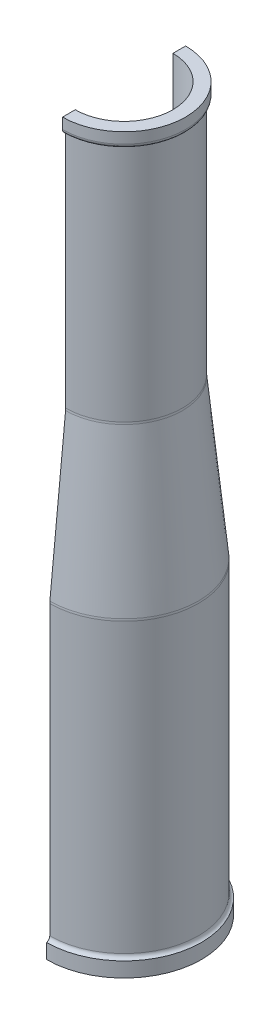
ISO-10303-21;
HEADER;
FILE_DESCRIPTION(('STEP AP214'),'2;1');
FILE_NAME('part.step','',(''),(''),'','','');
FILE_SCHEMA(('AUTOMOTIVE_DESIGN { 1 0 10303 214 1 1 1 1 }'));
ENDSEC;
DATA;
#1=APPLICATION_CONTEXT('core data for automotive mechanical design processes');
#2=APPLICATION_PROTOCOL_DEFINITION('international standard','automotive_design',2000,#1);
#3=PRODUCT_CONTEXT('',#1,'mechanical');
#4=PRODUCT('Part','Part','',(#3));
#5=PRODUCT_RELATED_PRODUCT_CATEGORY('part','',(#4));
#6=PRODUCT_DEFINITION_FORMATION('','',#4);
#7=PRODUCT_DEFINITION_CONTEXT('part definition',#1,'design');
#8=PRODUCT_DEFINITION('design','',#6,#7);
#9=PRODUCT_DEFINITION_SHAPE('','',#8);
#10=(LENGTH_UNIT() NAMED_UNIT(*) SI_UNIT(.MILLI.,.METRE.));
#11=(NAMED_UNIT(*) PLANE_ANGLE_UNIT() SI_UNIT($,.RADIAN.));
#12=(NAMED_UNIT(*) SI_UNIT($,.STERADIAN.) SOLID_ANGLE_UNIT());
#13=UNCERTAINTY_MEASURE_WITH_UNIT(LENGTH_MEASURE(1.E-05),#10,'distance_accuracy_value','');
#14=(GEOMETRIC_REPRESENTATION_CONTEXT(3) GLOBAL_UNCERTAINTY_ASSIGNED_CONTEXT((#13)) GLOBAL_UNIT_ASSIGNED_CONTEXT((#10,
#11,#12)) REPRESENTATION_CONTEXT('',''));
#15=CARTESIAN_POINT('',(0.,0.,0.));
#16=DIRECTION('',(0.,0.,1.));
#17=DIRECTION('',(1.,0.,0.));
#18=AXIS2_PLACEMENT_3D('',#15,#16,#17);
#19=CARTESIAN_POINT('',(0.,340.,0.));
#20=DIRECTION('',(0.,-1.,0.));
#21=DIRECTION('',(0.,0.,-1.));
#22=AXIS2_PLACEMENT_3D('',#19,#20,#21);
#23=CYLINDRICAL_SURFACE('',#22,27.5);
#24=CARTESIAN_POINT('',(0.,333.,0.));
#25=DIRECTION('',(0.,1.,0.));
#26=DIRECTION('',(0.,0.,1.));
#27=AXIS2_PLACEMENT_3D('',#24,#25,#26);
#28=CIRCLE('',#27,27.5);
#29=CARTESIAN_POINT('',(0.,333.,27.5));
#30=VERTEX_POINT('',#29);
#31=CARTESIAN_POINT('',(0.,333.,-27.5));
#32=VERTEX_POINT('',#31);
#33=EDGE_CURVE('E167',#30,#32,#28,.T.);
#34=ORIENTED_EDGE('',*,*,#33,.F.);
#35=DIRECTION('',(0.,-1.,0.));
#36=VECTOR('',#35,1.);
#37=CARTESIAN_POINT('',(0.,340.,27.5));
#38=LINE('',#37,#36);
#39=CARTESIAN_POINT('',(0.,220.498756211209,27.5));
#40=VERTEX_POINT('',#39);
#41=EDGE_CURVE('E190',#30,#40,#38,.T.);
#42=ORIENTED_EDGE('',*,*,#41,.T.);
#43=CARTESIAN_POINT('',(0.,220.498756211209,0.));
#44=DIRECTION('',(0.,1.,0.));
#45=DIRECTION('',(0.,0.,1.));
#46=AXIS2_PLACEMENT_3D('',#43,#44,#45);
#47=CIRCLE('',#46,27.5);
#48=CARTESIAN_POINT('',(0.,220.498756211209,-27.5));
#49=VERTEX_POINT('',#48);
#50=EDGE_CURVE('E150',#40,#49,#47,.T.);
#51=ORIENTED_EDGE('',*,*,#50,.T.);
#52=DIRECTION('',(0.,-1.,0.));
#53=VECTOR('',#52,1.);
#54=CARTESIAN_POINT('',(0.,340.,-27.5));
#55=LINE('',#54,#53);
#56=EDGE_CURVE('E216',#49,#32,#55,.F.);
#57=ORIENTED_EDGE('',*,*,#56,.T.);
#58=EDGE_LOOP('',(#34,#42,#51,#57));
#59=FACE_BOUND('',#58,.T.);
#60=ADVANCED_FACE('F38',(#59),#23,.T.);
#61=CARTESIAN_POINT('',(0.,145.,0.));
#62=DIRECTION('',(0.,-1.,0.));
#63=DIRECTION('',(0.,0.,-1.));
#64=AXIS2_PLACEMENT_3D('',#61,#62,#63);
#65=CYLINDRICAL_SURFACE('',#64,35.);
#66=CARTESIAN_POINT('',(0.,144.501243788791,0.));
#67=DIRECTION('',(0.,-1.,0.));
#68=DIRECTION('',(0.,0.,-1.));
#69=AXIS2_PLACEMENT_3D('',#66,#67,#68);
#70=CIRCLE('',#69,35.);
#71=CARTESIAN_POINT('',(0.,144.501243788791,-35.));
#72=VERTEX_POINT('',#71);
#73=CARTESIAN_POINT('',(0.,144.501243788791,35.));
#74=VERTEX_POINT('',#73);
#75=EDGE_CURVE('E164',#72,#74,#70,.T.);
#76=ORIENTED_EDGE('',*,*,#75,.T.);
#77=DIRECTION('',(0.,-1.,0.));
#78=VECTOR('',#77,1.);
#79=CARTESIAN_POINT('',(0.,145.,35.));
#80=LINE('',#79,#78);
#81=CARTESIAN_POINT('',(0.,8.93649167310371,35.));
#82=VERTEX_POINT('',#81);
#83=EDGE_CURVE('E143',#74,#82,#80,.T.);
#84=ORIENTED_EDGE('',*,*,#83,.T.);
#85=CARTESIAN_POINT('',(0.,8.9364916731037,0.));
#86=DIRECTION('',(0.,-1.,0.));
#87=DIRECTION('',(0.,0.,-1.));
#88=AXIS2_PLACEMENT_3D('',#85,#86,#87);
#89=CIRCLE('',#88,35.);
#90=CARTESIAN_POINT('',(0.,8.9364916731037,-35.));
#91=VERTEX_POINT('',#90);
#92=EDGE_CURVE('E171',#82,#91,#89,.F.);
#93=ORIENTED_EDGE('',*,*,#92,.T.);
#94=DIRECTION('',(0.,-1.,0.));
#95=VECTOR('',#94,1.);
#96=CARTESIAN_POINT('',(0.,145.,-35.));
#97=LINE('',#96,#95);
#98=EDGE_CURVE('E60',#91,#72,#97,.F.);
#99=ORIENTED_EDGE('',*,*,#98,.T.);
#100=EDGE_LOOP('',(#76,#84,#93,#99));
#101=FACE_BOUND('',#100,.T.);
#102=ADVANCED_FACE('F177',(#101),#65,.T.);
#103=CARTESIAN_POINT('',(0.,220.,0.));
#104=DIRECTION('',(0.,-1.,0.));
#105=DIRECTION('',(0.,0.,-1.));
#106=AXIS2_PLACEMENT_3D('',#103,#104,#105);
#107=CONICAL_SURFACE('',#106,27.5,0.0996686524911622);
#108=DIRECTION('',(0.,-0.995037190209989,0.0995037190209991));
#109=VECTOR('',#108,1.);
#110=CARTESIAN_POINT('',(0.,495.,0.));
#111=LINE('',#110,#109);
#112=CARTESIAN_POINT('',(0.,145.496280979001,34.9503719020999));
#113=VERTEX_POINT('',#112);
#114=CARTESIAN_POINT('',(0.,219.503719020999,27.5496280979001));
#115=VERTEX_POINT('',#114);
#116=EDGE_CURVE('E182',#113,#115,#111,.F.);
#117=ORIENTED_EDGE('',*,*,#116,.F.);
#118=CARTESIAN_POINT('',(0.,145.496280979001,0.));
#119=DIRECTION('',(0.,-1.,0.));
#120=DIRECTION('',(0.,0.,-1.));
#121=AXIS2_PLACEMENT_3D('',#118,#119,#120);
#122=CIRCLE('',#121,34.9503719020999);
#123=CARTESIAN_POINT('',(0.,145.496280979001,-34.9503719020999));
#124=VERTEX_POINT('',#123);
#125=EDGE_CURVE('E158',#113,#124,#122,.F.);
#126=ORIENTED_EDGE('',*,*,#125,.T.);
#127=DIRECTION('',(0.,0.995037190209989,0.0995037190209991));
#128=VECTOR('',#127,1.);
#129=CARTESIAN_POINT('',(0.,495.,0.));
#130=LINE('',#129,#128);
#131=CARTESIAN_POINT('',(0.,219.503719020999,-27.5496280979001));
#132=VERTEX_POINT('',#131);
#133=EDGE_CURVE('E222',#132,#124,#130,.F.);
#134=ORIENTED_EDGE('',*,*,#133,.F.);
#135=CARTESIAN_POINT('',(0.,219.503719020999,0.));
#136=DIRECTION('',(0.,1.,0.));
#137=DIRECTION('',(0.,0.,1.));
#138=AXIS2_PLACEMENT_3D('',#135,#136,#137);
#139=CIRCLE('',#138,27.5496280979001);
#140=EDGE_CURVE('E161',#132,#115,#139,.F.);
#141=ORIENTED_EDGE('',*,*,#140,.T.);
#142=EDGE_LOOP('',(#117,#126,#134,#141));
#143=FACE_BOUND('',#142,.T.);
#144=ADVANCED_FACE('F244',(#143),#107,.T.);
#145=CARTESIAN_POINT('',(0.,340.,0.));
#146=DIRECTION('',(0.,1.,0.));
#147=DIRECTION('',(0.,0.,1.));
#148=AXIS2_PLACEMENT_3D('',#145,#146,#147);
#149=PLANE('',#148);
#150=DIRECTION('',(0.,0.,-1.));
#151=VECTOR('',#150,1.);
#152=CARTESIAN_POINT('',(0.,340.,0.));
#153=LINE('',#152,#151);
#154=CARTESIAN_POINT('',(0.,340.,29.));
#155=VERTEX_POINT('',#154);
#156=CARTESIAN_POINT('',(0.,340.,23.));
#157=VERTEX_POINT('',#156);
#158=EDGE_CURVE('E197',#155,#157,#153,.T.);
#159=ORIENTED_EDGE('',*,*,#158,.F.);
#160=CARTESIAN_POINT('',(0.,340.,0.));
#161=DIRECTION('',(0.,1.,0.));
#162=DIRECTION('',(0.,0.,1.));
#163=AXIS2_PLACEMENT_3D('',#160,#161,#162);
#164=CIRCLE('',#163,29.);
#165=CARTESIAN_POINT('',(0.,340.,-29.));
#166=VERTEX_POINT('',#165);
#167=EDGE_CURVE('E199',#155,#166,#164,.T.);
#168=ORIENTED_EDGE('',*,*,#167,.T.);
#169=CARTESIAN_POINT('',(0.,340.,-23.));
#170=VERTEX_POINT('',#169);
#171=EDGE_CURVE('E209',#170,#166,#153,.T.);
#172=ORIENTED_EDGE('',*,*,#171,.F.);
#173=CARTESIAN_POINT('',(0.,340.,0.));
#174=DIRECTION('',(0.,1.,0.));
#175=DIRECTION('',(0.,0.,1.));
#176=AXIS2_PLACEMENT_3D('',#173,#174,#175);
#177=CIRCLE('',#176,23.);
#178=EDGE_CURVE('E148',#157,#170,#177,.T.);
#179=ORIENTED_EDGE('',*,*,#178,.F.);
#180=EDGE_LOOP('',(#159,#168,#172,#179));
#181=FACE_BOUND('',#180,.T.);
#182=ADVANCED_FACE('F249',(#181),#149,.T.);
#183=CARTESIAN_POINT('',(0.,7.,0.));
#184=DIRECTION('',(0.,-1.,0.));
#185=DIRECTION('',(0.,0.,-1.));
#186=AXIS2_PLACEMENT_3D('',#183,#184,#185);
#187=CYLINDRICAL_SURFACE('',#186,36.5);
#188=DIRECTION('',(0.,-1.,0.));
#189=VECTOR('',#188,1.);
#190=CARTESIAN_POINT('',(0.,7.,36.5));
#191=LINE('',#190,#189);
#192=CARTESIAN_POINT('',(0.,0.,36.5));
#193=VERTEX_POINT('',#192);
#194=CARTESIAN_POINT('',(0.,7.,36.5));
#195=VERTEX_POINT('',#194);
#196=EDGE_CURVE('E53',#193,#195,#191,.F.);
#197=ORIENTED_EDGE('',*,*,#196,.F.);
#198=CARTESIAN_POINT('',(0.,0.,0.));
#199=DIRECTION('',(0.,-1.,0.));
#200=DIRECTION('',(0.,0.,-1.));
#201=AXIS2_PLACEMENT_3D('',#198,#199,#200);
#202=CIRCLE('',#201,36.5);
#203=CARTESIAN_POINT('',(0.,0.,-36.5));
#204=VERTEX_POINT('',#203);
#205=EDGE_CURVE('E140',#204,#193,#202,.T.);
#206=ORIENTED_EDGE('',*,*,#205,.F.);
#207=DIRECTION('',(0.,-1.,0.));
#208=VECTOR('',#207,1.);
#209=CARTESIAN_POINT('',(0.,7.,-36.5));
#210=LINE('',#209,#208);
#211=CARTESIAN_POINT('',(0.,7.,-36.5));
#212=VERTEX_POINT('',#211);
#213=EDGE_CURVE('E132',#212,#204,#210,.T.);
#214=ORIENTED_EDGE('',*,*,#213,.F.);
#215=CARTESIAN_POINT('',(0.,7.,0.));
#216=DIRECTION('',(0.,-1.,0.));
#217=DIRECTION('',(0.,0.,-1.));
#218=AXIS2_PLACEMENT_3D('',#215,#216,#217);
#219=CIRCLE('',#218,36.5);
#220=EDGE_CURVE('E142',#212,#195,#219,.T.);
#221=ORIENTED_EDGE('',*,*,#220,.T.);
#222=EDGE_LOOP('',(#197,#206,#214,#221));
#223=FACE_BOUND('',#222,.T.);
#224=ADVANCED_FACE('F138',(#223),#187,.T.);
#225=CARTESIAN_POINT('',(0.,0.,0.));
#226=DIRECTION('',(0.,1.,0.));
#227=DIRECTION('',(0.,0.,1.));
#228=AXIS2_PLACEMENT_3D('',#225,#226,#227);
#229=PLANE('',#228);
#230=ORIENTED_EDGE('',*,*,#205,.T.);
#231=DIRECTION('',(0.,0.,-1.));
#232=VECTOR('',#231,1.);
#233=CARTESIAN_POINT('',(0.,0.,-50.261715238614));
#234=LINE('',#233,#232);
#235=CARTESIAN_POINT('',(0.,0.,23.));
#236=VERTEX_POINT('',#235);
#237=EDGE_CURVE('E124',#193,#236,#234,.T.);
#238=ORIENTED_EDGE('',*,*,#237,.T.);
#239=CARTESIAN_POINT('',(0.,0.,0.));
#240=DIRECTION('',(0.,-1.,0.));
#241=DIRECTION('',(0.,0.,-1.));
#242=AXIS2_PLACEMENT_3D('',#239,#240,#241);
#243=CIRCLE('',#242,23.);
#244=CARTESIAN_POINT('',(0.,0.,-23.));
#245=VERTEX_POINT('',#244);
#246=EDGE_CURVE('E153',#245,#236,#243,.T.);
#247=ORIENTED_EDGE('',*,*,#246,.F.);
#248=EDGE_CURVE('E133',#245,#204,#234,.T.);
#249=ORIENTED_EDGE('',*,*,#248,.T.);
#250=EDGE_LOOP('',(#230,#238,#247,#249));
#251=FACE_BOUND('',#250,.T.);
#252=ADVANCED_FACE('F147',(#251),#229,.F.);
#253=CARTESIAN_POINT('',(0.,525.,0.));
#254=DIRECTION('',(0.,-1.,0.));
#255=DIRECTION('',(0.,0.,-1.));
#256=AXIS2_PLACEMENT_3D('',#253,#254,#255);
#257=CYLINDRICAL_SURFACE('',#256,23.);
#258=ORIENTED_EDGE('',*,*,#246,.T.);
#259=DIRECTION('',(0.,-1.,0.));
#260=VECTOR('',#259,1.);
#261=CARTESIAN_POINT('',(0.,525.,23.));
#262=LINE('',#261,#260);
#263=EDGE_CURVE('E127',#236,#157,#262,.F.);
#264=ORIENTED_EDGE('',*,*,#263,.T.);
#265=ORIENTED_EDGE('',*,*,#178,.T.);
#266=DIRECTION('',(0.,-1.,0.));
#267=VECTOR('',#266,1.);
#268=CARTESIAN_POINT('',(0.,525.,-23.));
#269=LINE('',#268,#267);
#270=EDGE_CURVE('E144',#170,#245,#269,.T.);
#271=ORIENTED_EDGE('',*,*,#270,.T.);
#272=EDGE_LOOP('',(#258,#264,#265,#271));
#273=FACE_BOUND('',#272,.T.);
#274=ADVANCED_FACE('F206',(#273),#257,.F.);
#275=CARTESIAN_POINT('',(0.,220.498756211209,0.));
#276=DIRECTION('',(0.,1.,0.));
#277=DIRECTION('',(0.,0.,1.));
#278=AXIS2_PLACEMENT_3D('',#275,#276,#277);
#279=TOROIDAL_SURFACE('',#278,37.5,10.);
#280=ORIENTED_EDGE('',*,*,#140,.F.);
#281=CARTESIAN_POINT('',(0.,220.498756211209,-37.5));
#282=DIRECTION('',(1.,0.,0.));
#283=DIRECTION('',(0.,0.,-1.));
#284=AXIS2_PLACEMENT_3D('',#281,#282,#283);
#285=CIRCLE('',#284,10.);
#286=EDGE_CURVE('E219',#132,#49,#285,.F.);
#287=ORIENTED_EDGE('',*,*,#286,.T.);
#288=ORIENTED_EDGE('',*,*,#50,.F.);
#289=CARTESIAN_POINT('',(0.,220.498756211209,37.5));
#290=DIRECTION('',(1.,0.,0.));
#291=DIRECTION('',(0.,0.,-1.));
#292=AXIS2_PLACEMENT_3D('',#289,#290,#291);
#293=CIRCLE('',#292,10.);
#294=EDGE_CURVE('E187',#40,#115,#293,.F.);
#295=ORIENTED_EDGE('',*,*,#294,.T.);
#296=EDGE_LOOP('',(#280,#287,#288,#295));
#297=FACE_BOUND('',#296,.T.);
#298=ADVANCED_FACE('F256',(#297),#279,.F.);
#299=CARTESIAN_POINT('',(0.,144.501243788791,0.));
#300=DIRECTION('',(0.,-1.,0.));
#301=DIRECTION('',(0.,0.,-1.));
#302=AXIS2_PLACEMENT_3D('',#299,#300,#301);
#303=TOROIDAL_SURFACE('',#302,25.,10.);
#304=CARTESIAN_POINT('',(0.,144.501243788791,25.));
#305=DIRECTION('',(1.,0.,0.));
#306=DIRECTION('',(0.,0.,-1.));
#307=AXIS2_PLACEMENT_3D('',#304,#305,#306);
#308=CIRCLE('',#307,10.);
#309=EDGE_CURVE('E180',#74,#113,#308,.F.);
#310=ORIENTED_EDGE('',*,*,#309,.F.);
#311=ORIENTED_EDGE('',*,*,#75,.F.);
#312=CARTESIAN_POINT('',(0.,144.501243788791,-25.));
#313=DIRECTION('',(1.,0.,0.));
#314=DIRECTION('',(0.,0.,-1.));
#315=AXIS2_PLACEMENT_3D('',#312,#313,#314);
#316=CIRCLE('',#315,10.);
#317=EDGE_CURVE('E224',#124,#72,#316,.F.);
#318=ORIENTED_EDGE('',*,*,#317,.F.);
#319=ORIENTED_EDGE('',*,*,#125,.F.);
#320=EDGE_LOOP('',(#310,#311,#318,#319));
#321=FACE_BOUND('',#320,.T.);
#322=ADVANCED_FACE('F259',(#321),#303,.T.);
#323=CARTESIAN_POINT('',(0.,333.,0.));
#324=DIRECTION('',(0.,1.,0.));
#325=DIRECTION('',(0.,0.,1.));
#326=AXIS2_PLACEMENT_3D('',#323,#324,#325);
#327=CYLINDRICAL_SURFACE('',#326,29.);
#328=DIRECTION('',(0.,1.,0.));
#329=VECTOR('',#328,1.);
#330=CARTESIAN_POINT('',(0.,333.,-29.));
#331=LINE('',#330,#329);
#332=CARTESIAN_POINT('',(0.,334.936491673104,-29.));
#333=VERTEX_POINT('',#332);
#334=EDGE_CURVE('E210',#166,#333,#331,.F.);
#335=ORIENTED_EDGE('',*,*,#334,.F.);
#336=ORIENTED_EDGE('',*,*,#167,.F.);
#337=DIRECTION('',(0.,1.,0.));
#338=VECTOR('',#337,1.);
#339=CARTESIAN_POINT('',(0.,333.,29.));
#340=LINE('',#339,#338);
#341=CARTESIAN_POINT('',(0.,334.936491673104,29.));
#342=VERTEX_POINT('',#341);
#343=EDGE_CURVE('E195',#342,#155,#340,.T.);
#344=ORIENTED_EDGE('',*,*,#343,.F.);
#345=CARTESIAN_POINT('',(0.,334.936491673104,0.));
#346=DIRECTION('',(0.,-1.,0.));
#347=DIRECTION('',(0.,0.,-1.));
#348=AXIS2_PLACEMENT_3D('',#345,#346,#347);
#349=CIRCLE('',#348,29.);
#350=EDGE_CURVE('E168',#342,#333,#349,.F.);
#351=ORIENTED_EDGE('',*,*,#350,.T.);
#352=EDGE_LOOP('',(#335,#336,#344,#351));
#353=FACE_BOUND('',#352,.T.);
#354=ADVANCED_FACE('F262',(#353),#327,.T.);
#355=CARTESIAN_POINT('',(0.,334.936491673104,0.));
#356=DIRECTION('',(0.,-1.,0.));
#357=DIRECTION('',(0.,0.,-1.));
#358=AXIS2_PLACEMENT_3D('',#355,#356,#357);
#359=TOROIDAL_SURFACE('',#358,27.,2.);
#360=CARTESIAN_POINT('',(0.,334.936491673104,27.));
#361=DIRECTION('',(1.,0.,0.));
#362=DIRECTION('',(0.,0.,-1.));
#363=AXIS2_PLACEMENT_3D('',#360,#361,#362);
#364=CIRCLE('',#363,2.);
#365=EDGE_CURVE('E193',#30,#342,#364,.F.);
#366=ORIENTED_EDGE('',*,*,#365,.F.);
#367=ORIENTED_EDGE('',*,*,#33,.T.);
#368=CARTESIAN_POINT('',(0.,334.936491673104,-27.));
#369=DIRECTION('',(1.,0.,0.));
#370=DIRECTION('',(0.,0.,-1.));
#371=AXIS2_PLACEMENT_3D('',#368,#369,#370);
#372=CIRCLE('',#371,2.);
#373=EDGE_CURVE('E214',#333,#32,#372,.F.);
#374=ORIENTED_EDGE('',*,*,#373,.F.);
#375=ORIENTED_EDGE('',*,*,#350,.F.);
#376=EDGE_LOOP('',(#366,#367,#374,#375));
#377=FACE_BOUND('',#376,.T.);
#378=ADVANCED_FACE('F236',(#377),#359,.T.);
#379=CARTESIAN_POINT('',(0.,8.93649167310371,0.));
#380=DIRECTION('',(0.,-1.,0.));
#381=DIRECTION('',(0.,0.,-1.));
#382=AXIS2_PLACEMENT_3D('',#379,#380,#381);
#383=TOROIDAL_SURFACE('',#382,37.,2.);
#384=ORIENTED_EDGE('',*,*,#92,.F.);
#385=CARTESIAN_POINT('',(0.,8.93649167310371,37.));
#386=DIRECTION('',(1.,0.,0.));
#387=DIRECTION('',(0.,0.,-1.));
#388=AXIS2_PLACEMENT_3D('',#385,#386,#387);
#389=CIRCLE('',#388,2.);
#390=EDGE_CURVE('E12',#82,#195,#389,.F.);
#391=ORIENTED_EDGE('',*,*,#390,.T.);
#392=ORIENTED_EDGE('',*,*,#220,.F.);
#393=CARTESIAN_POINT('',(0.,8.93649167310371,-37.));
#394=DIRECTION('',(1.,0.,0.));
#395=DIRECTION('',(0.,0.,-1.));
#396=AXIS2_PLACEMENT_3D('',#393,#394,#395);
#397=CIRCLE('',#396,2.);
#398=EDGE_CURVE('E46',#212,#91,#397,.F.);
#399=ORIENTED_EDGE('',*,*,#398,.T.);
#400=EDGE_LOOP('',(#384,#391,#392,#399));
#401=FACE_BOUND('',#400,.T.);
#402=ADVANCED_FACE('F40',(#401),#383,.F.);
#403=CARTESIAN_POINT('',(0.,0.,0.));
#404=DIRECTION('',(1.,0.,0.));
#405=DIRECTION('',(0.,0.,-1.));
#406=AXIS2_PLACEMENT_3D('',#403,#404,#405);
#407=PLANE('',#406);
#408=ORIENTED_EDGE('',*,*,#171,.T.);
#409=ORIENTED_EDGE('',*,*,#334,.T.);
#410=ORIENTED_EDGE('',*,*,#373,.T.);
#411=ORIENTED_EDGE('',*,*,#56,.F.);
#412=ORIENTED_EDGE('',*,*,#286,.F.);
#413=ORIENTED_EDGE('',*,*,#133,.T.);
#414=ORIENTED_EDGE('',*,*,#317,.T.);
#415=ORIENTED_EDGE('',*,*,#98,.F.);
#416=ORIENTED_EDGE('',*,*,#398,.F.);
#417=ORIENTED_EDGE('',*,*,#213,.T.);
#418=ORIENTED_EDGE('',*,*,#248,.F.);
#419=ORIENTED_EDGE('',*,*,#270,.F.);
#420=EDGE_LOOP('',(#408,#409,#410,#411,#412,#413,#414,#415,#416,#417,#418,#419));
#421=FACE_BOUND('',#420,.T.);
#422=ADVANCED_FACE('F227',(#421),#407,.F.);
#423=ORIENTED_EDGE('',*,*,#237,.F.);
#424=ORIENTED_EDGE('',*,*,#196,.T.);
#425=ORIENTED_EDGE('',*,*,#390,.F.);
#426=ORIENTED_EDGE('',*,*,#83,.F.);
#427=ORIENTED_EDGE('',*,*,#309,.T.);
#428=ORIENTED_EDGE('',*,*,#116,.T.);
#429=ORIENTED_EDGE('',*,*,#294,.F.);
#430=ORIENTED_EDGE('',*,*,#41,.F.);
#431=ORIENTED_EDGE('',*,*,#365,.T.);
#432=ORIENTED_EDGE('',*,*,#343,.T.);
#433=ORIENTED_EDGE('',*,*,#158,.T.);
#434=ORIENTED_EDGE('',*,*,#263,.F.);
#435=EDGE_LOOP('',(#423,#424,#425,#426,#427,#428,#429,#430,#431,#432,#433,#434));
#436=FACE_BOUND('',#435,.T.);
#437=ADVANCED_FACE('F125',(#436),#407,.F.);
#438=CLOSED_SHELL('',(#60,#102,#144,#182,#224,#252,#274,#298,#322,#354,#378,#402,#422,#437));
#439=MANIFOLD_SOLID_BREP('B2',#438);
#440=ADVANCED_BREP_SHAPE_REPRESENTATION('',(#18,#439),#14);
#441=SHAPE_DEFINITION_REPRESENTATION(#9,#440);
ENDSEC;
END-ISO-10303-21;
